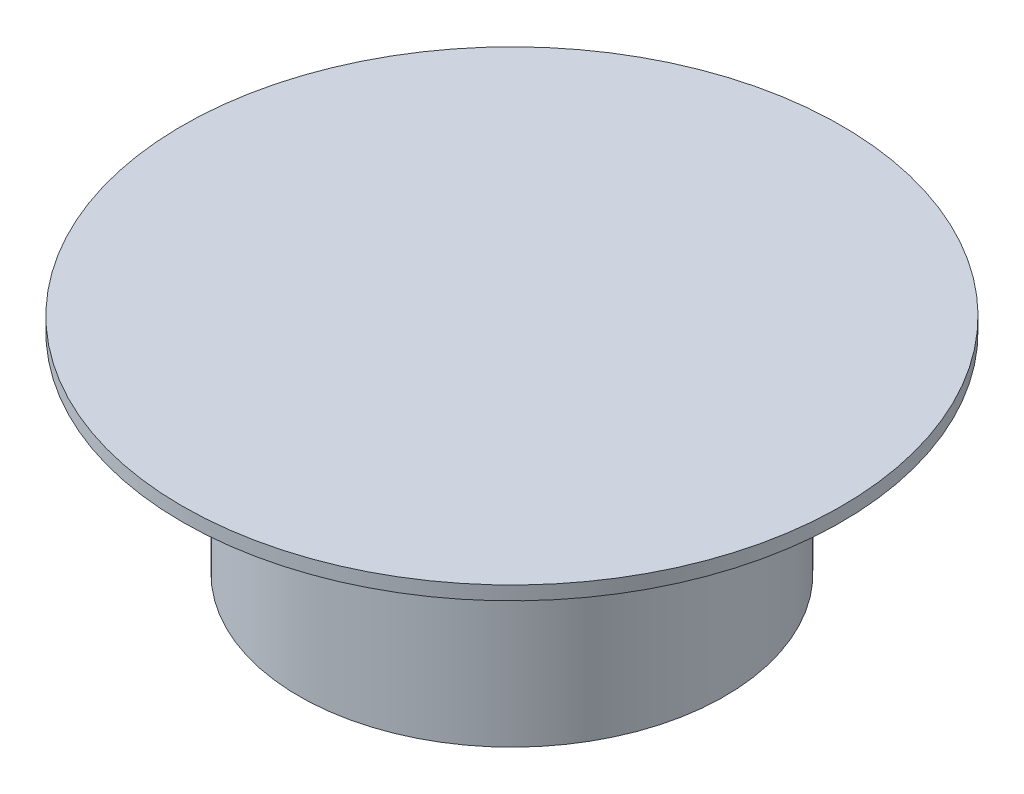
ISO-10303-21;
HEADER;
FILE_DESCRIPTION(('STEP AP214'),'2;1');
FILE_NAME('part.step','',(''),(''),'','','');
FILE_SCHEMA(('AUTOMOTIVE_DESIGN { 1 0 10303 214 1 1 1 1 }'));
ENDSEC;
DATA;
#1=APPLICATION_CONTEXT('core data for automotive mechanical design processes');
#2=APPLICATION_PROTOCOL_DEFINITION('international standard','automotive_design',2000,#1);
#3=PRODUCT_CONTEXT('',#1,'mechanical');
#4=PRODUCT('Part','Part','',(#3));
#5=PRODUCT_RELATED_PRODUCT_CATEGORY('part','',(#4));
#6=PRODUCT_DEFINITION_FORMATION('','',#4);
#7=PRODUCT_DEFINITION_CONTEXT('part definition',#1,'design');
#8=PRODUCT_DEFINITION('design','',#6,#7);
#9=PRODUCT_DEFINITION_SHAPE('','',#8);
#10=(LENGTH_UNIT() NAMED_UNIT(*) SI_UNIT(.MILLI.,.METRE.));
#11=(NAMED_UNIT(*) PLANE_ANGLE_UNIT() SI_UNIT($,.RADIAN.));
#12=(NAMED_UNIT(*) SI_UNIT($,.STERADIAN.) SOLID_ANGLE_UNIT());
#13=UNCERTAINTY_MEASURE_WITH_UNIT(LENGTH_MEASURE(1.E-05),#10,'distance_accuracy_value','');
#14=(GEOMETRIC_REPRESENTATION_CONTEXT(3) GLOBAL_UNCERTAINTY_ASSIGNED_CONTEXT((#13)) GLOBAL_UNIT_ASSIGNED_CONTEXT((#10,
#11,#12)) REPRESENTATION_CONTEXT('',''));
#15=CARTESIAN_POINT('',(0.,0.,0.));
#16=DIRECTION('',(0.,0.,1.));
#17=DIRECTION('',(1.,0.,0.));
#18=AXIS2_PLACEMENT_3D('',#15,#16,#17);
#19=CARTESIAN_POINT('',(0.,3.81,0.));
#20=DIRECTION('',(0.,-1.,0.));
#21=DIRECTION('',(0.,0.,-1.));
#22=AXIS2_PLACEMENT_3D('',#19,#20,#21);
#23=CYLINDRICAL_SURFACE('',#22,3.875);
#24=CARTESIAN_POINT('',(0.,3.81,0.));
#25=DIRECTION('',(0.,1.,0.));
#26=DIRECTION('',(0.,0.,1.));
#27=AXIS2_PLACEMENT_3D('',#24,#25,#26);
#28=CIRCLE('',#27,3.875);
#29=CARTESIAN_POINT('',(0.,3.81,-3.875));
#30=VERTEX_POINT('',#29);
#31=EDGE_CURVE('E10',#30,#30,#28,.T.);
#32=CARTESIAN_POINT('',(0.,0.,0.));
#33=DIRECTION('',(0.,1.,0.));
#34=DIRECTION('',(0.,0.,1.));
#35=AXIS2_PLACEMENT_3D('',#32,#33,#34);
#36=CIRCLE('',#35,3.875);
#37=CARTESIAN_POINT('',(0.,0.,-3.875));
#38=VERTEX_POINT('',#37);
#39=EDGE_CURVE('E44',#38,#38,#36,.T.);
#40=CARTESIAN_POINT('',(0.,3.81,-3.875));
#41=CARTESIAN_POINT('',(0.,3.7703125,-3.875));
#42=CARTESIAN_POINT('',(0.,3.730625,-3.875));
#43=CARTESIAN_POINT('',(0.,3.65125,-3.875));
#44=CARTESIAN_POINT('',(0.,3.6115625,-3.875));
#45=CARTESIAN_POINT('',(0.,3.5321875,-3.875));
#46=CARTESIAN_POINT('',(0.,3.4925,-3.875));
#47=CARTESIAN_POINT('',(0.,3.413125,-3.875));
#48=CARTESIAN_POINT('',(0.,3.3734375,-3.875));
#49=CARTESIAN_POINT('',(0.,3.2940625,-3.875));
#50=CARTESIAN_POINT('',(0.,3.254375,-3.875));
#51=CARTESIAN_POINT('',(0.,3.175,-3.875));
#52=CARTESIAN_POINT('',(0.,3.1353125,-3.875));
#53=CARTESIAN_POINT('',(0.,3.0559375,-3.875));
#54=CARTESIAN_POINT('',(0.,3.01625,-3.875));
#55=CARTESIAN_POINT('',(0.,2.936875,-3.875));
#56=CARTESIAN_POINT('',(0.,2.8971875,-3.875));
#57=CARTESIAN_POINT('',(0.,2.8178125,-3.875));
#58=CARTESIAN_POINT('',(0.,2.778125,-3.875));
#59=CARTESIAN_POINT('',(0.,2.69875,-3.875));
#60=CARTESIAN_POINT('',(0.,2.6590625,-3.875));
#61=CARTESIAN_POINT('',(0.,2.5796875,-3.875));
#62=CARTESIAN_POINT('',(0.,2.54,-3.875));
#63=CARTESIAN_POINT('',(0.,2.460625,-3.875));
#64=CARTESIAN_POINT('',(0.,2.4209375,-3.875));
#65=CARTESIAN_POINT('',(0.,2.3415625,-3.875));
#66=CARTESIAN_POINT('',(0.,2.301875,-3.875));
#67=CARTESIAN_POINT('',(0.,2.2225,-3.875));
#68=CARTESIAN_POINT('',(0.,2.1828125,-3.875));
#69=CARTESIAN_POINT('',(0.,2.1034375,-3.875));
#70=CARTESIAN_POINT('',(0.,2.06375,-3.875));
#71=CARTESIAN_POINT('',(0.,1.984375,-3.875));
#72=CARTESIAN_POINT('',(0.,1.9446875,-3.875));
#73=CARTESIAN_POINT('',(0.,1.8653125,-3.875));
#74=CARTESIAN_POINT('',(0.,1.825625,-3.875));
#75=CARTESIAN_POINT('',(0.,1.74625,-3.875));
#76=CARTESIAN_POINT('',(0.,1.7065625,-3.875));
#77=CARTESIAN_POINT('',(0.,1.6271875,-3.875));
#78=CARTESIAN_POINT('',(0.,1.5875,-3.875));
#79=CARTESIAN_POINT('',(0.,1.508125,-3.875));
#80=CARTESIAN_POINT('',(0.,1.4684375,-3.875));
#81=CARTESIAN_POINT('',(0.,1.3890625,-3.875));
#82=CARTESIAN_POINT('',(0.,1.349375,-3.875));
#83=CARTESIAN_POINT('',(0.,1.27,-3.875));
#84=CARTESIAN_POINT('',(0.,1.2303125,-3.875));
#85=CARTESIAN_POINT('',(0.,1.1509375,-3.875));
#86=CARTESIAN_POINT('',(0.,1.11125,-3.875));
#87=CARTESIAN_POINT('',(0.,1.031875,-3.875));
#88=CARTESIAN_POINT('',(0.,0.9921875,-3.875));
#89=CARTESIAN_POINT('',(0.,0.9128125,-3.875));
#90=CARTESIAN_POINT('',(0.,0.873125,-3.875));
#91=CARTESIAN_POINT('',(0.,0.79375,-3.875));
#92=CARTESIAN_POINT('',(0.,0.7540625,-3.875));
#93=CARTESIAN_POINT('',(0.,0.6746875,-3.875));
#94=CARTESIAN_POINT('',(0.,0.635,-3.875));
#95=CARTESIAN_POINT('',(0.,0.555625,-3.875));
#96=CARTESIAN_POINT('',(0.,0.5159375,-3.875));
#97=CARTESIAN_POINT('',(0.,0.4365625,-3.875));
#98=CARTESIAN_POINT('',(0.,0.396875,-3.875));
#99=CARTESIAN_POINT('',(0.,0.3175,-3.875));
#100=CARTESIAN_POINT('',(0.,0.2778125,-3.875));
#101=CARTESIAN_POINT('',(0.,0.1984375,-3.875));
#102=CARTESIAN_POINT('',(0.,0.15875,-3.875));
#103=CARTESIAN_POINT('',(0.,0.0793749999999999,-3.875));
#104=CARTESIAN_POINT('',(0.,0.0396874999999999,-3.875));
#105=CARTESIAN_POINT('',(0.,0.,-3.875));
#106=B_SPLINE_CURVE_WITH_KNOTS('',3,(#40,#41,#42,#43,#44,#45,#46,#47,#48,#49,#50,#51,#52,#53,
#54,#55,#56,#57,#58,#59,#60,#61,#62,#63,#64,#65,#66,#67,#68,#69,#70,#71,#72,#73,#74,#75,#76,#77,
#78,#79,#80,#81,#82,#83,#84,#85,#86,#87,#88,#89,#90,#91,#92,#93,#94,#95,#96,#97,#98,#99,#100,
#101,#102,#103,#104,#105),.UNSPECIFIED.,.F.,.F.,(4,2,2,2,2,2,2,2,2,2,2,2,2,2,2,2,2,2,2,2,2,2,2,
2,2,2,2,2,2,2,2,2,4),(0.,0.1190625,0.238125,0.3571875,0.47625,0.595312499999999,0.714375,
0.833437499999999,0.952499999999999,1.0715625,1.190625,1.3096875,1.42875,1.5478125,1.666875,
1.7859375,1.905,2.0240625,2.143125,2.2621875,2.38125,2.5003125,2.619375,2.7384375,2.8575,
2.9765625,3.095625,3.2146875,3.33375,3.4528125,3.571875,3.6909375,3.81),.UNSPECIFIED.);
#107=EDGE_CURVE('BSEAM41',#30,#38,#106,.T.);
#108=ORIENTED_EDGE('',*,*,#31,.F.);
#109=ORIENTED_EDGE('',*,*,#39,.T.);
#110=ORIENTED_EDGE('',*,*,#107,.T.);
#111=ORIENTED_EDGE('',*,*,#107,.F.);
#112=EDGE_LOOP('',(#108,#110,#109,#111));
#113=FACE_BOUND('',#112,.T.);
#114=ADVANCED_FACE('F41',(#113),#23,.T.);
#115=CARTESIAN_POINT('',(0.,0.,0.));
#116=DIRECTION('',(0.,1.,0.));
#117=DIRECTION('',(0.,0.,1.));
#118=AXIS2_PLACEMENT_3D('',#115,#116,#117);
#119=PLANE('',#118);
#120=ORIENTED_EDGE('',*,*,#39,.F.);
#121=EDGE_LOOP('',(#120));
#122=FACE_BOUND('',#121,.T.);
#123=ADVANCED_FACE('F68',(#122),#119,.F.);
#124=CARTESIAN_POINT('',(0.,4.06,0.));
#125=DIRECTION('',(0.,-1.,0.));
#126=DIRECTION('',(0.,0.,-1.));
#127=AXIS2_PLACEMENT_3D('',#124,#125,#126);
#128=CYLINDRICAL_SURFACE('',#127,6.);
#129=CARTESIAN_POINT('',(0.,4.06,0.));
#130=DIRECTION('',(0.,1.,0.));
#131=DIRECTION('',(0.,0.,1.));
#132=AXIS2_PLACEMENT_3D('',#129,#130,#131);
#133=CIRCLE('',#132,6.);
#134=CARTESIAN_POINT('',(0.,4.06,6.));
#135=VERTEX_POINT('',#134);
#136=EDGE_CURVE('E53',#135,#135,#133,.T.);
#137=ORIENTED_EDGE('',*,*,#136,.F.);
#138=EDGE_LOOP('',(#137));
#139=FACE_BOUND('',#138,.T.);
#140=CARTESIAN_POINT('',(0.,3.81,0.));
#141=DIRECTION('',(0.,1.,0.));
#142=DIRECTION('',(0.,0.,1.));
#143=AXIS2_PLACEMENT_3D('',#140,#141,#142);
#144=CIRCLE('',#143,6.);
#145=CARTESIAN_POINT('',(0.,3.81,6.));
#146=VERTEX_POINT('',#145);
#147=EDGE_CURVE('E55',#146,#146,#144,.T.);
#148=ORIENTED_EDGE('',*,*,#147,.T.);
#149=EDGE_LOOP('',(#148));
#150=FACE_BOUND('',#149,.T.);
#151=ADVANCED_FACE('F65',(#139,#150),#128,.T.);
#152=CARTESIAN_POINT('',(0.,4.06,0.));
#153=DIRECTION('',(0.,1.,0.));
#154=DIRECTION('',(0.,0.,1.));
#155=AXIS2_PLACEMENT_3D('',#152,#153,#154);
#156=PLANE('',#155);
#157=ORIENTED_EDGE('',*,*,#136,.T.);
#158=EDGE_LOOP('',(#157));
#159=FACE_BOUND('',#158,.T.);
#160=ADVANCED_FACE('F63',(#159),#156,.T.);
#161=CARTESIAN_POINT('',(0.,3.81,0.));
#162=DIRECTION('',(0.,1.,0.));
#163=DIRECTION('',(0.,0.,1.));
#164=AXIS2_PLACEMENT_3D('',#161,#162,#163);
#165=PLANE('',#164);
#166=ORIENTED_EDGE('',*,*,#31,.T.);
#167=EDGE_LOOP('',(#166));
#168=FACE_BOUND('',#167,.T.);
#169=ORIENTED_EDGE('',*,*,#147,.F.);
#170=EDGE_LOOP('',(#169));
#171=FACE_BOUND('',#170,.T.);
#172=ADVANCED_FACE('F72',(#168,#171),#165,.F.);
#173=CLOSED_SHELL('',(#114,#123,#151,#160,#172));
#174=MANIFOLD_SOLID_BREP('B2',#173);
#175=ADVANCED_BREP_SHAPE_REPRESENTATION('',(#18,#174),#14);
#176=SHAPE_DEFINITION_REPRESENTATION(#9,#175);
ENDSEC;
END-ISO-10303-21;
